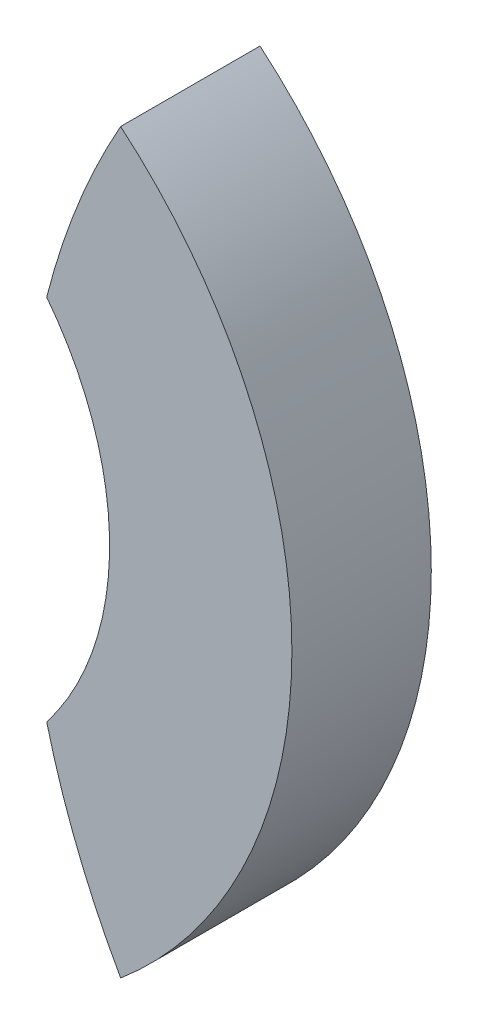
ISO-10303-21;
HEADER;
FILE_DESCRIPTION(('STEP AP214'),'2;1');
FILE_NAME('part.step','',(''),(''),'','','');
FILE_SCHEMA(('AUTOMOTIVE_DESIGN { 1 0 10303 214 1 1 1 1 }'));
ENDSEC;
DATA;
#1=APPLICATION_CONTEXT('core data for automotive mechanical design processes');
#2=APPLICATION_PROTOCOL_DEFINITION('international standard','automotive_design',2000,#1);
#3=PRODUCT_CONTEXT('',#1,'mechanical');
#4=PRODUCT('Part','Part','',(#3));
#5=PRODUCT_RELATED_PRODUCT_CATEGORY('part','',(#4));
#6=PRODUCT_DEFINITION_FORMATION('','',#4);
#7=PRODUCT_DEFINITION_CONTEXT('part definition',#1,'design');
#8=PRODUCT_DEFINITION('design','',#6,#7);
#9=PRODUCT_DEFINITION_SHAPE('','',#8);
#10=(LENGTH_UNIT() NAMED_UNIT(*) SI_UNIT(.MILLI.,.METRE.));
#11=(NAMED_UNIT(*) PLANE_ANGLE_UNIT() SI_UNIT($,.RADIAN.));
#12=(NAMED_UNIT(*) SI_UNIT($,.STERADIAN.) SOLID_ANGLE_UNIT());
#13=UNCERTAINTY_MEASURE_WITH_UNIT(LENGTH_MEASURE(1.E-05),#10,'distance_accuracy_value','');
#14=(GEOMETRIC_REPRESENTATION_CONTEXT(3) GLOBAL_UNCERTAINTY_ASSIGNED_CONTEXT((#13)) GLOBAL_UNIT_ASSIGNED_CONTEXT((#10,
#11,#12)) REPRESENTATION_CONTEXT('',''));
#15=CARTESIAN_POINT('',(0.,0.,0.));
#16=DIRECTION('',(0.,0.,1.));
#17=DIRECTION('',(1.,0.,0.));
#18=AXIS2_PLACEMENT_3D('',#15,#16,#17);
#19=CARTESIAN_POINT('',(45.,0.,6.5));
#20=DIRECTION('',(0.,0.,-1.));
#21=DIRECTION('',(-1.,0.,0.));
#22=AXIS2_PLACEMENT_3D('',#19,#20,#21);
#23=CYLINDRICAL_SURFACE('',#22,35.);
#24=CARTESIAN_POINT('',(45.,0.,0.));
#25=DIRECTION('',(0.,0.,1.));
#26=DIRECTION('',(1.,0.,0.));
#27=AXIS2_PLACEMENT_3D('',#24,#25,#26);
#28=CIRCLE('',#27,35.);
#29=CARTESIAN_POINT('',(14.5138888888889,17.192935448055,0.));
#30=VERTEX_POINT('',#29);
#31=CARTESIAN_POINT('',(11.0666666666667,8.57489876843389,0.));
#32=VERTEX_POINT('',#31);
#33=EDGE_CURVE('E75',#30,#32,#28,.T.);
#34=ORIENTED_EDGE('',*,*,#33,.T.);
#35=DIRECTION('',(0.,0.,-1.));
#36=VECTOR('',#35,1.);
#37=CARTESIAN_POINT('',(11.0666666666667,8.57489876843389,6.5));
#38=LINE('',#37,#36);
#39=CARTESIAN_POINT('',(11.0666666666667,8.57489876843389,6.5));
#40=VERTEX_POINT('',#39);
#41=EDGE_CURVE('E11',#40,#32,#38,.T.);
#42=ORIENTED_EDGE('',*,*,#41,.F.);
#43=CARTESIAN_POINT('',(45.,0.,6.5));
#44=DIRECTION('',(0.,0.,1.));
#45=DIRECTION('',(1.,0.,0.));
#46=AXIS2_PLACEMENT_3D('',#43,#44,#45);
#47=CIRCLE('',#46,35.);
#48=CARTESIAN_POINT('',(14.5138888888889,17.192935448055,6.5));
#49=VERTEX_POINT('',#48);
#50=EDGE_CURVE('E93',#49,#40,#47,.T.);
#51=ORIENTED_EDGE('',*,*,#50,.F.);
#52=DIRECTION('',(0.,0.,-1.));
#53=VECTOR('',#52,1.);
#54=CARTESIAN_POINT('',(14.5138888888889,17.192935448055,6.5));
#55=LINE('',#54,#53);
#56=EDGE_CURVE('E87',#49,#30,#55,.T.);
#57=ORIENTED_EDGE('',*,*,#56,.T.);
#58=EDGE_LOOP('',(#34,#42,#51,#57));
#59=FACE_BOUND('',#58,.T.);
#60=ADVANCED_FACE('F31',(#59),#23,.T.);
#61=CARTESIAN_POINT('',(0.,0.,6.5));
#62=DIRECTION('',(0.,0.,-1.));
#63=DIRECTION('',(-1.,0.,0.));
#64=AXIS2_PLACEMENT_3D('',#61,#62,#63);
#65=CYLINDRICAL_SURFACE('',#64,14.);
#66=CARTESIAN_POINT('',(0.,0.,0.));
#67=DIRECTION('',(0.,0.,-1.));
#68=DIRECTION('',(1.,0.,0.));
#69=AXIS2_PLACEMENT_3D('',#66,#67,#68);
#70=CIRCLE('',#69,14.);
#71=CARTESIAN_POINT('',(11.0666666666667,-8.57489876843388,0.));
#72=VERTEX_POINT('',#71);
#73=EDGE_CURVE('E71',#32,#72,#70,.T.);
#74=ORIENTED_EDGE('',*,*,#73,.T.);
#75=DIRECTION('',(0.,0.,-1.));
#76=VECTOR('',#75,1.);
#77=CARTESIAN_POINT('',(11.0666666666667,-8.57489876843388,6.5));
#78=LINE('',#77,#76);
#79=CARTESIAN_POINT('',(11.0666666666667,-8.57489876843388,6.5));
#80=VERTEX_POINT('',#79);
#81=EDGE_CURVE('E38',#80,#72,#78,.T.);
#82=ORIENTED_EDGE('',*,*,#81,.F.);
#83=CARTESIAN_POINT('',(0.,0.,6.5));
#84=DIRECTION('',(0.,0.,-1.));
#85=DIRECTION('',(1.,0.,0.));
#86=AXIS2_PLACEMENT_3D('',#83,#84,#85);
#87=CIRCLE('',#86,14.);
#88=EDGE_CURVE('E83',#40,#80,#87,.T.);
#89=ORIENTED_EDGE('',*,*,#88,.F.);
#90=ORIENTED_EDGE('',*,*,#41,.T.);
#91=EDGE_LOOP('',(#74,#82,#89,#90));
#92=FACE_BOUND('',#91,.T.);
#93=ADVANCED_FACE('F82',(#92),#65,.F.);
#94=CARTESIAN_POINT('',(45.,0.,6.5));
#95=DIRECTION('',(0.,0.,-1.));
#96=DIRECTION('',(-1.,0.,0.));
#97=AXIS2_PLACEMENT_3D('',#94,#95,#96);
#98=CYLINDRICAL_SURFACE('',#97,35.);
#99=CARTESIAN_POINT('',(45.,0.,0.));
#100=DIRECTION('',(0.,0.,1.));
#101=DIRECTION('',(1.,0.,0.));
#102=AXIS2_PLACEMENT_3D('',#99,#100,#101);
#103=CIRCLE('',#102,35.);
#104=CARTESIAN_POINT('',(14.5138888888889,-17.192935448055,0.));
#105=VERTEX_POINT('',#104);
#106=EDGE_CURVE('E76',#72,#105,#103,.T.);
#107=ORIENTED_EDGE('',*,*,#106,.T.);
#108=DIRECTION('',(0.,0.,-1.));
#109=VECTOR('',#108,1.);
#110=CARTESIAN_POINT('',(14.5138888888889,-17.192935448055,6.5));
#111=LINE('',#110,#109);
#112=CARTESIAN_POINT('',(14.5138888888889,-17.192935448055,6.5));
#113=VERTEX_POINT('',#112);
#114=EDGE_CURVE('E99',#113,#105,#111,.T.);
#115=ORIENTED_EDGE('',*,*,#114,.F.);
#116=CARTESIAN_POINT('',(45.,0.,6.5));
#117=DIRECTION('',(0.,0.,1.));
#118=DIRECTION('',(1.,0.,0.));
#119=AXIS2_PLACEMENT_3D('',#116,#117,#118);
#120=CIRCLE('',#119,35.);
#121=EDGE_CURVE('E50',#80,#113,#120,.T.);
#122=ORIENTED_EDGE('',*,*,#121,.F.);
#123=ORIENTED_EDGE('',*,*,#81,.T.);
#124=EDGE_LOOP('',(#107,#115,#122,#123));
#125=FACE_BOUND('',#124,.T.);
#126=ADVANCED_FACE('F102',(#125),#98,.T.);
#127=CARTESIAN_POINT('',(0.,0.,6.5));
#128=DIRECTION('',(0.,0.,-1.));
#129=DIRECTION('',(-1.,0.,0.));
#130=AXIS2_PLACEMENT_3D('',#127,#128,#129);
#131=CYLINDRICAL_SURFACE('',#130,22.5);
#132=CARTESIAN_POINT('',(0.,0.,0.));
#133=DIRECTION('',(0.,0.,1.));
#134=DIRECTION('',(1.,0.,0.));
#135=AXIS2_PLACEMENT_3D('',#132,#133,#134);
#136=CIRCLE('',#135,22.5);
#137=EDGE_CURVE('E91',#105,#30,#136,.T.);
#138=ORIENTED_EDGE('',*,*,#137,.T.);
#139=ORIENTED_EDGE('',*,*,#56,.F.);
#140=CARTESIAN_POINT('',(0.,0.,6.5));
#141=DIRECTION('',(0.,0.,1.));
#142=DIRECTION('',(1.,0.,0.));
#143=AXIS2_PLACEMENT_3D('',#140,#141,#142);
#144=CIRCLE('',#143,22.5);
#145=EDGE_CURVE('E45',#113,#49,#144,.T.);
#146=ORIENTED_EDGE('',*,*,#145,.F.);
#147=ORIENTED_EDGE('',*,*,#114,.T.);
#148=EDGE_LOOP('',(#138,#139,#146,#147));
#149=FACE_BOUND('',#148,.T.);
#150=ADVANCED_FACE('F104',(#149),#131,.T.);
#151=CARTESIAN_POINT('',(22.5,0.,6.5));
#152=DIRECTION('',(0.,0.,1.));
#153=DIRECTION('',(1.,0.,0.));
#154=AXIS2_PLACEMENT_3D('',#151,#152,#153);
#155=PLANE('',#154);
#156=ORIENTED_EDGE('',*,*,#50,.T.);
#157=ORIENTED_EDGE('',*,*,#88,.T.);
#158=ORIENTED_EDGE('',*,*,#121,.T.);
#159=ORIENTED_EDGE('',*,*,#145,.T.);
#160=EDGE_LOOP('',(#156,#157,#158,#159));
#161=FACE_BOUND('',#160,.T.);
#162=ADVANCED_FACE('F105',(#161),#155,.T.);
#163=CARTESIAN_POINT('',(22.5,0.,0.));
#164=DIRECTION('',(0.,0.,1.));
#165=DIRECTION('',(1.,0.,0.));
#166=AXIS2_PLACEMENT_3D('',#163,#164,#165);
#167=PLANE('',#166);
#168=ORIENTED_EDGE('',*,*,#33,.F.);
#169=ORIENTED_EDGE('',*,*,#137,.F.);
#170=ORIENTED_EDGE('',*,*,#106,.F.);
#171=ORIENTED_EDGE('',*,*,#73,.F.);
#172=EDGE_LOOP('',(#168,#169,#170,#171));
#173=FACE_BOUND('',#172,.T.);
#174=ADVANCED_FACE('F72',(#173),#167,.F.);
#175=CLOSED_SHELL('',(#60,#93,#126,#150,#162,#174));
#176=MANIFOLD_SOLID_BREP('B2',#175);
#177=ADVANCED_BREP_SHAPE_REPRESENTATION('',(#18,#176),#14);
#178=SHAPE_DEFINITION_REPRESENTATION(#9,#177);
ENDSEC;
END-ISO-10303-21;
